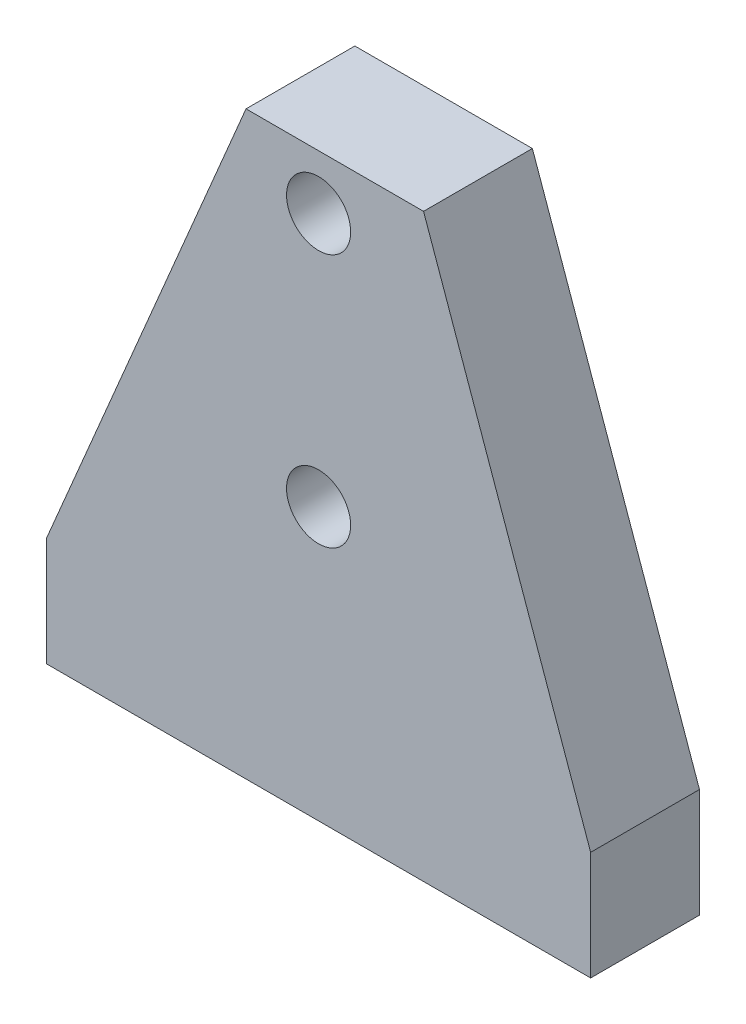
ISO-10303-21;
HEADER;
FILE_DESCRIPTION(('STEP AP214'),'2;1');
FILE_NAME('part.step','',(''),(''),'','','');
FILE_SCHEMA(('AUTOMOTIVE_DESIGN { 1 0 10303 214 1 1 1 1 }'));
ENDSEC;
DATA;
#1=APPLICATION_CONTEXT('core data for automotive mechanical design processes');
#2=APPLICATION_PROTOCOL_DEFINITION('international standard','automotive_design',2000,#1);
#3=PRODUCT_CONTEXT('',#1,'mechanical');
#4=PRODUCT('Part','Part','',(#3));
#5=PRODUCT_RELATED_PRODUCT_CATEGORY('part','',(#4));
#6=PRODUCT_DEFINITION_FORMATION('','',#4);
#7=PRODUCT_DEFINITION_CONTEXT('part definition',#1,'design');
#8=PRODUCT_DEFINITION('design','',#6,#7);
#9=PRODUCT_DEFINITION_SHAPE('','',#8);
#10=(LENGTH_UNIT() NAMED_UNIT(*) SI_UNIT(.MILLI.,.METRE.));
#11=(NAMED_UNIT(*) PLANE_ANGLE_UNIT() SI_UNIT($,.RADIAN.));
#12=(NAMED_UNIT(*) SI_UNIT($,.STERADIAN.) SOLID_ANGLE_UNIT());
#13=UNCERTAINTY_MEASURE_WITH_UNIT(LENGTH_MEASURE(1.E-05),#10,'distance_accuracy_value','');
#14=(GEOMETRIC_REPRESENTATION_CONTEXT(3) GLOBAL_UNCERTAINTY_ASSIGNED_CONTEXT((#13)) GLOBAL_UNIT_ASSIGNED_CONTEXT((#10,
#11,#12)) REPRESENTATION_CONTEXT('',''));
#15=CARTESIAN_POINT('',(0.,0.,0.));
#16=DIRECTION('',(0.,0.,1.));
#17=DIRECTION('',(1.,0.,0.));
#18=AXIS2_PLACEMENT_3D('',#15,#16,#17);
#19=CARTESIAN_POINT('',(-14.5006273525722,6.13488080301129,9.525));
#20=DIRECTION('',(-0.920967251068559,0.389639990836697,0.));
#21=DIRECTION('',(-0.389639990836697,-0.920967251068559,0.));
#22=AXIS2_PLACEMENT_3D('',#19,#20,#21);
#23=PLANE('',#22);
#24=DIRECTION('',(0.389639990836697,0.920967251068559,0.));
#25=VECTOR('',#24,1.);
#26=CARTESIAN_POINT('',(-14.5006273525722,6.13488080301129,0.));
#27=LINE('',#26,#25);
#28=CARTESIAN_POINT('',(-23.8125,-15.875,0.));
#29=VERTEX_POINT('',#28);
#30=CARTESIAN_POINT('',(-6.35000000000003,25.4,0.));
#31=VERTEX_POINT('',#30);
#32=EDGE_CURVE('E120',#29,#31,#27,.T.);
#33=ORIENTED_EDGE('',*,*,#32,.F.);
#34=DIRECTION('',(0.,0.,-1.));
#35=VECTOR('',#34,1.);
#36=CARTESIAN_POINT('',(-23.8125,-15.875,9.525));
#37=LINE('',#36,#35);
#38=CARTESIAN_POINT('',(-23.8125,-15.875,9.525));
#39=VERTEX_POINT('',#38);
#40=EDGE_CURVE('E11',#39,#29,#37,.T.);
#41=ORIENTED_EDGE('',*,*,#40,.F.);
#42=DIRECTION('',(0.389639990836697,0.920967251068559,0.));
#43=VECTOR('',#42,1.);
#44=CARTESIAN_POINT('',(-14.5006273525722,6.13488080301129,9.525));
#45=LINE('',#44,#43);
#46=CARTESIAN_POINT('',(-6.35000000000003,25.4,9.525));
#47=VERTEX_POINT('',#46);
#48=EDGE_CURVE('E134',#39,#47,#45,.T.);
#49=ORIENTED_EDGE('',*,*,#48,.T.);
#50=DIRECTION('',(0.,0.,-1.));
#51=VECTOR('',#50,1.);
#52=CARTESIAN_POINT('',(-6.35000000000003,25.4,9.525));
#53=LINE('',#52,#51);
#54=EDGE_CURVE('E53',#47,#31,#53,.T.);
#55=ORIENTED_EDGE('',*,*,#54,.T.);
#56=EDGE_LOOP('',(#33,#41,#49,#55));
#57=FACE_BOUND('',#56,.T.);
#58=ADVANCED_FACE('F37',(#57),#23,.T.);
#59=CARTESIAN_POINT('',(-23.8125,0.,9.525));
#60=DIRECTION('',(1.,0.,0.));
#61=DIRECTION('',(0.,1.,0.));
#62=AXIS2_PLACEMENT_3D('',#59,#60,#61);
#63=PLANE('',#62);
#64=DIRECTION('',(0.,-1.,0.));
#65=VECTOR('',#64,1.);
#66=CARTESIAN_POINT('',(-23.8125,0.,0.));
#67=LINE('',#66,#65);
#68=CARTESIAN_POINT('',(-23.8125,-25.4,0.));
#69=VERTEX_POINT('',#68);
#70=EDGE_CURVE('E122',#29,#69,#67,.T.);
#71=ORIENTED_EDGE('',*,*,#70,.T.);
#72=DIRECTION('',(0.,0.,-1.));
#73=VECTOR('',#72,1.);
#74=CARTESIAN_POINT('',(-23.8125,-25.4,9.525));
#75=LINE('',#74,#73);
#76=CARTESIAN_POINT('',(-23.8125,-25.4,9.525));
#77=VERTEX_POINT('',#76);
#78=EDGE_CURVE('E45',#77,#69,#75,.T.);
#79=ORIENTED_EDGE('',*,*,#78,.F.);
#80=DIRECTION('',(0.,-1.,0.));
#81=VECTOR('',#80,1.);
#82=CARTESIAN_POINT('',(-23.8125,0.,9.525));
#83=LINE('',#82,#81);
#84=EDGE_CURVE('E115',#39,#77,#83,.T.);
#85=ORIENTED_EDGE('',*,*,#84,.F.);
#86=ORIENTED_EDGE('',*,*,#40,.T.);
#87=EDGE_LOOP('',(#71,#79,#85,#86));
#88=FACE_BOUND('',#87,.T.);
#89=ADVANCED_FACE('F158',(#88),#63,.F.);
#90=CARTESIAN_POINT('',(0.,-25.4,9.525));
#91=DIRECTION('',(0.,1.,0.));
#92=DIRECTION('',(0.,0.,1.));
#93=AXIS2_PLACEMENT_3D('',#90,#91,#92);
#94=PLANE('',#93);
#95=CARTESIAN_POINT('',(-13.9954,-25.4,4.76250000000001));
#96=DIRECTION('',(0.,-1.,0.));
#97=DIRECTION('',(0.,0.,-1.));
#98=AXIS2_PLACEMENT_3D('',#95,#96,#97);
#99=CIRCLE('',#98,2.49999999999999);
#100=CARTESIAN_POINT('',(-13.9954,-25.4,2.26250000000002));
#101=VERTEX_POINT('',#100);
#102=EDGE_CURVE('E273',#101,#101,#99,.T.);
#103=ORIENTED_EDGE('',*,*,#102,.F.);
#104=EDGE_LOOP('',(#103));
#105=FACE_BOUND('',#104,.T.);
#106=CARTESIAN_POINT('',(13.9954,-25.4,4.76250000000001));
#107=DIRECTION('',(0.,-1.,0.));
#108=DIRECTION('',(0.,0.,-1.));
#109=AXIS2_PLACEMENT_3D('',#106,#107,#108);
#110=CIRCLE('',#109,2.49999999999999);
#111=CARTESIAN_POINT('',(13.9954,-25.4,2.26250000000001));
#112=VERTEX_POINT('',#111);
#113=EDGE_CURVE('E275',#112,#112,#110,.T.);
#114=ORIENTED_EDGE('',*,*,#113,.F.);
#115=EDGE_LOOP('',(#114));
#116=FACE_BOUND('',#115,.T.);
#117=DIRECTION('',(1.,0.,0.));
#118=VECTOR('',#117,1.);
#119=CARTESIAN_POINT('',(0.,-25.4,0.));
#120=LINE('',#119,#118);
#121=CARTESIAN_POINT('',(23.8125,-25.4,0.));
#122=VERTEX_POINT('',#121);
#123=EDGE_CURVE('E125',#69,#122,#120,.T.);
#124=ORIENTED_EDGE('',*,*,#123,.T.);
#125=DIRECTION('',(0.,0.,-1.));
#126=VECTOR('',#125,1.);
#127=CARTESIAN_POINT('',(23.8125,-25.4,9.525));
#128=LINE('',#127,#126);
#129=CARTESIAN_POINT('',(23.8125,-25.4,9.525));
#130=VERTEX_POINT('',#129);
#131=EDGE_CURVE('E101',#130,#122,#128,.T.);
#132=ORIENTED_EDGE('',*,*,#131,.F.);
#133=DIRECTION('',(1.,0.,0.));
#134=VECTOR('',#133,1.);
#135=CARTESIAN_POINT('',(0.,-25.4,9.525));
#136=LINE('',#135,#134);
#137=EDGE_CURVE('E112',#77,#130,#136,.T.);
#138=ORIENTED_EDGE('',*,*,#137,.F.);
#139=ORIENTED_EDGE('',*,*,#78,.T.);
#140=EDGE_LOOP('',(#124,#132,#138,#139));
#141=FACE_BOUND('',#140,.T.);
#142=ADVANCED_FACE('F141',(#105,#116,#141),#94,.F.);
#143=CARTESIAN_POINT('',(23.8125,0.,9.525));
#144=DIRECTION('',(1.,0.,0.));
#145=DIRECTION('',(0.,1.,0.));
#146=AXIS2_PLACEMENT_3D('',#143,#144,#145);
#147=PLANE('',#146);
#148=DIRECTION('',(0.,-1.,0.));
#149=VECTOR('',#148,1.);
#150=CARTESIAN_POINT('',(23.8125,0.,0.));
#151=LINE('',#150,#149);
#152=CARTESIAN_POINT('',(23.8125,-15.875,0.));
#153=VERTEX_POINT('',#152);
#154=EDGE_CURVE('E98',#153,#122,#151,.T.);
#155=ORIENTED_EDGE('',*,*,#154,.F.);
#156=DIRECTION('',(0.,0.,-1.));
#157=VECTOR('',#156,1.);
#158=CARTESIAN_POINT('',(23.8125,-15.875,9.525));
#159=LINE('',#158,#157);
#160=CARTESIAN_POINT('',(23.8125,-15.875,9.525));
#161=VERTEX_POINT('',#160);
#162=EDGE_CURVE('E92',#161,#153,#159,.T.);
#163=ORIENTED_EDGE('',*,*,#162,.F.);
#164=DIRECTION('',(0.,-1.,0.));
#165=VECTOR('',#164,1.);
#166=CARTESIAN_POINT('',(23.8125,0.,9.525));
#167=LINE('',#166,#165);
#168=EDGE_CURVE('E96',#161,#130,#167,.T.);
#169=ORIENTED_EDGE('',*,*,#168,.T.);
#170=ORIENTED_EDGE('',*,*,#131,.T.);
#171=EDGE_LOOP('',(#155,#163,#169,#170));
#172=FACE_BOUND('',#171,.T.);
#173=ADVANCED_FACE('F94',(#172),#147,.T.);
#174=CARTESIAN_POINT('',(16.1581752394906,5.72572901331465,9.525));
#175=DIRECTION('',(-0.942571369899435,-0.334004809315528,0.));
#176=DIRECTION('',(0.334004809315528,-0.942571369899435,0.));
#177=AXIS2_PLACEMENT_3D('',#174,#175,#176);
#178=PLANE('',#177);
#179=DIRECTION('',(-0.334004809315528,0.942571369899435,0.));
#180=VECTOR('',#179,1.);
#181=CARTESIAN_POINT('',(16.1581752394906,5.72572901331465,0.));
#182=LINE('',#181,#180);
#183=CARTESIAN_POINT('',(9.186500373076,25.4,0.));
#184=VERTEX_POINT('',#183);
#185=EDGE_CURVE('E129',#153,#184,#182,.T.);
#186=ORIENTED_EDGE('',*,*,#185,.T.);
#187=DIRECTION('',(0.,0.,-1.));
#188=VECTOR('',#187,1.);
#189=CARTESIAN_POINT('',(9.186500373076,25.4,9.525));
#190=LINE('',#189,#188);
#191=CARTESIAN_POINT('',(9.186500373076,25.4,9.525));
#192=VERTEX_POINT('',#191);
#193=EDGE_CURVE('E73',#192,#184,#190,.T.);
#194=ORIENTED_EDGE('',*,*,#193,.F.);
#195=DIRECTION('',(-0.334004809315528,0.942571369899435,0.));
#196=VECTOR('',#195,1.);
#197=CARTESIAN_POINT('',(16.1581752394906,5.72572901331465,9.525));
#198=LINE('',#197,#196);
#199=EDGE_CURVE('E103',#161,#192,#198,.T.);
#200=ORIENTED_EDGE('',*,*,#199,.F.);
#201=ORIENTED_EDGE('',*,*,#162,.T.);
#202=EDGE_LOOP('',(#186,#194,#200,#201));
#203=FACE_BOUND('',#202,.T.);
#204=ADVANCED_FACE('F104',(#203),#178,.F.);
#205=CARTESIAN_POINT('',(0.,25.4,9.525));
#206=DIRECTION('',(0.,1.,0.));
#207=DIRECTION('',(0.,0.,1.));
#208=AXIS2_PLACEMENT_3D('',#205,#206,#207);
#209=PLANE('',#208);
#210=DIRECTION('',(1.,0.,0.));
#211=VECTOR('',#210,1.);
#212=CARTESIAN_POINT('',(0.,25.4,0.));
#213=LINE('',#212,#211);
#214=EDGE_CURVE('E131',#31,#184,#213,.T.);
#215=ORIENTED_EDGE('',*,*,#214,.F.);
#216=ORIENTED_EDGE('',*,*,#54,.F.);
#217=DIRECTION('',(1.,0.,0.));
#218=VECTOR('',#217,1.);
#219=CARTESIAN_POINT('',(0.,25.4,9.525));
#220=LINE('',#219,#218);
#221=EDGE_CURVE('E107',#47,#192,#220,.T.);
#222=ORIENTED_EDGE('',*,*,#221,.T.);
#223=ORIENTED_EDGE('',*,*,#193,.T.);
#224=EDGE_LOOP('',(#215,#216,#222,#223));
#225=FACE_BOUND('',#224,.T.);
#226=ADVANCED_FACE('F146',(#225),#209,.T.);
#227=CARTESIAN_POINT('',(0.,0.,9.525));
#228=DIRECTION('',(0.,0.,1.));
#229=DIRECTION('',(1.,0.,0.));
#230=AXIS2_PLACEMENT_3D('',#227,#228,#229);
#231=PLANE('',#230);
#232=CARTESIAN_POINT('',(0.,20.6375,9.525));
#233=DIRECTION('',(0.,0.,1.));
#234=DIRECTION('',(1.,0.,0.));
#235=AXIS2_PLACEMENT_3D('',#232,#233,#234);
#236=CIRCLE('',#235,2.80669999999999);
#237=CARTESIAN_POINT('',(2.80669999999998,20.6375,9.525));
#238=VERTEX_POINT('',#237);
#239=EDGE_CURVE('E283',#238,#238,#236,.T.);
#240=ORIENTED_EDGE('',*,*,#239,.F.);
#241=EDGE_LOOP('',(#240));
#242=FACE_BOUND('',#241,.T.);
#243=CARTESIAN_POINT('',(0.,-1.58749999999999,9.525));
#244=DIRECTION('',(0.,0.,1.));
#245=DIRECTION('',(1.,0.,0.));
#246=AXIS2_PLACEMENT_3D('',#243,#244,#245);
#247=CIRCLE('',#246,2.80669999999999);
#248=CARTESIAN_POINT('',(2.80669999999998,-1.58749999999999,9.525));
#249=VERTEX_POINT('',#248);
#250=EDGE_CURVE('E289',#249,#249,#247,.T.);
#251=ORIENTED_EDGE('',*,*,#250,.F.);
#252=EDGE_LOOP('',(#251));
#253=FACE_BOUND('',#252,.T.);
#254=ORIENTED_EDGE('',*,*,#48,.F.);
#255=ORIENTED_EDGE('',*,*,#84,.T.);
#256=ORIENTED_EDGE('',*,*,#137,.T.);
#257=ORIENTED_EDGE('',*,*,#168,.F.);
#258=ORIENTED_EDGE('',*,*,#199,.T.);
#259=ORIENTED_EDGE('',*,*,#221,.F.);
#260=EDGE_LOOP('',(#254,#255,#256,#257,#258,#259));
#261=FACE_BOUND('',#260,.T.);
#262=ADVANCED_FACE('F110',(#242,#253,#261),#231,.T.);
#263=CARTESIAN_POINT('',(0.,0.,0.));
#264=DIRECTION('',(0.,0.,1.));
#265=DIRECTION('',(1.,0.,0.));
#266=AXIS2_PLACEMENT_3D('',#263,#264,#265);
#267=PLANE('',#266);
#268=CARTESIAN_POINT('',(0.,20.6375,0.));
#269=DIRECTION('',(0.,0.,1.));
#270=DIRECTION('',(1.,0.,0.));
#271=AXIS2_PLACEMENT_3D('',#268,#269,#270);
#272=CIRCLE('',#271,2.8067);
#273=CARTESIAN_POINT('',(2.80669999999999,20.6375,0.));
#274=VERTEX_POINT('',#273);
#275=EDGE_CURVE('E286',#274,#274,#272,.T.);
#276=ORIENTED_EDGE('',*,*,#275,.T.);
#277=EDGE_LOOP('',(#276));
#278=FACE_BOUND('',#277,.T.);
#279=CARTESIAN_POINT('',(0.,-1.58749999999999,0.));
#280=DIRECTION('',(0.,0.,1.));
#281=DIRECTION('',(1.,0.,0.));
#282=AXIS2_PLACEMENT_3D('',#279,#280,#281);
#283=CIRCLE('',#282,2.8067);
#284=CARTESIAN_POINT('',(2.80669999999999,-1.58749999999999,0.));
#285=VERTEX_POINT('',#284);
#286=EDGE_CURVE('E123',#285,#285,#283,.T.);
#287=ORIENTED_EDGE('',*,*,#286,.T.);
#288=EDGE_LOOP('',(#287));
#289=FACE_BOUND('',#288,.T.);
#290=ORIENTED_EDGE('',*,*,#32,.T.);
#291=ORIENTED_EDGE('',*,*,#214,.T.);
#292=ORIENTED_EDGE('',*,*,#185,.F.);
#293=ORIENTED_EDGE('',*,*,#154,.T.);
#294=ORIENTED_EDGE('',*,*,#123,.F.);
#295=ORIENTED_EDGE('',*,*,#70,.F.);
#296=EDGE_LOOP('',(#290,#291,#292,#293,#294,#295));
#297=FACE_BOUND('',#296,.T.);
#298=ADVANCED_FACE('F145',(#278,#289,#297),#267,.F.);
#299=CARTESIAN_POINT('',(0.,-1.58749999999999,9.525));
#300=DIRECTION('',(0.,0.,1.));
#301=DIRECTION('',(1.,0.,0.));
#302=AXIS2_PLACEMENT_3D('',#299,#300,#301);
#303=CYLINDRICAL_SURFACE('',#302,2.80669999999999);
#304=ORIENTED_EDGE('',*,*,#286,.F.);
#305=EDGE_LOOP('',(#304));
#306=FACE_BOUND('',#305,.T.);
#307=ORIENTED_EDGE('',*,*,#250,.T.);
#308=EDGE_LOOP('',(#307));
#309=FACE_BOUND('',#308,.T.);
#310=ADVANCED_FACE('F196',(#306,#309),#303,.F.);
#311=CARTESIAN_POINT('',(0.,20.6375,9.525));
#312=DIRECTION('',(0.,0.,1.));
#313=DIRECTION('',(1.,0.,0.));
#314=AXIS2_PLACEMENT_3D('',#311,#312,#313);
#315=CYLINDRICAL_SURFACE('',#314,2.80669999999999);
#316=ORIENTED_EDGE('',*,*,#275,.F.);
#317=EDGE_LOOP('',(#316));
#318=FACE_BOUND('',#317,.T.);
#319=ORIENTED_EDGE('',*,*,#239,.T.);
#320=EDGE_LOOP('',(#319));
#321=FACE_BOUND('',#320,.T.);
#322=ADVANCED_FACE('F205',(#318,#321),#315,.F.);
#323=CARTESIAN_POINT('',(13.9954,-12.3952,4.76250000000001));
#324=DIRECTION('',(0.,1.,0.));
#325=DIRECTION('',(0.,0.,1.));
#326=AXIS2_PLACEMENT_3D('',#323,#324,#325);
#327=PLANE('',#326);
#328=CARTESIAN_POINT('',(13.9954,-12.3952,4.76250000000001));
#329=DIRECTION('',(0.,-1.,0.));
#330=DIRECTION('',(0.,0.,-1.));
#331=AXIS2_PLACEMENT_3D('',#328,#329,#330);
#332=CIRCLE('',#331,2.49999999999999);
#333=CARTESIAN_POINT('',(13.9954,-12.3952,2.26250000000002));
#334=VERTEX_POINT('',#333);
#335=EDGE_CURVE('E280',#334,#334,#332,.T.);
#336=ORIENTED_EDGE('',*,*,#335,.T.);
#337=EDGE_LOOP('',(#336));
#338=FACE_BOUND('',#337,.T.);
#339=ADVANCED_FACE('F214',(#338),#327,.F.);
#340=CARTESIAN_POINT('',(13.9954,-25.4,4.76250000000001));
#341=DIRECTION('',(0.,-1.,0.));
#342=DIRECTION('',(0.,0.,-1.));
#343=AXIS2_PLACEMENT_3D('',#340,#341,#342);
#344=CYLINDRICAL_SURFACE('',#343,2.49999999999999);
#345=ORIENTED_EDGE('',*,*,#335,.F.);
#346=EDGE_LOOP('',(#345));
#347=FACE_BOUND('',#346,.T.);
#348=ORIENTED_EDGE('',*,*,#113,.T.);
#349=EDGE_LOOP('',(#348));
#350=FACE_BOUND('',#349,.T.);
#351=ADVANCED_FACE('F230',(#347,#350),#344,.F.);
#352=CARTESIAN_POINT('',(-13.9954,-12.3952,4.76250000000001));
#353=DIRECTION('',(0.,1.,0.));
#354=DIRECTION('',(0.,0.,1.));
#355=AXIS2_PLACEMENT_3D('',#352,#353,#354);
#356=PLANE('',#355);
#357=CARTESIAN_POINT('',(-13.9954,-12.3952,4.76250000000001));
#358=DIRECTION('',(0.,-1.,0.));
#359=DIRECTION('',(0.,0.,-1.));
#360=AXIS2_PLACEMENT_3D('',#357,#358,#359);
#361=CIRCLE('',#360,2.49999999999999);
#362=CARTESIAN_POINT('',(-13.9954,-12.3952,2.26250000000002));
#363=VERTEX_POINT('',#362);
#364=EDGE_CURVE('E270',#363,#363,#361,.T.);
#365=ORIENTED_EDGE('',*,*,#364,.T.);
#366=EDGE_LOOP('',(#365));
#367=FACE_BOUND('',#366,.T.);
#368=ADVANCED_FACE('F241',(#367),#356,.F.);
#369=CARTESIAN_POINT('',(-13.9954,-25.4,4.76250000000001));
#370=DIRECTION('',(0.,-1.,0.));
#371=DIRECTION('',(0.,0.,-1.));
#372=AXIS2_PLACEMENT_3D('',#369,#370,#371);
#373=CYLINDRICAL_SURFACE('',#372,2.49999999999999);
#374=ORIENTED_EDGE('',*,*,#364,.F.);
#375=EDGE_LOOP('',(#374));
#376=FACE_BOUND('',#375,.T.);
#377=ORIENTED_EDGE('',*,*,#102,.T.);
#378=EDGE_LOOP('',(#377));
#379=FACE_BOUND('',#378,.T.);
#380=ADVANCED_FACE('F252',(#376,#379),#373,.F.);
#381=CLOSED_SHELL('',(#58,#89,#142,#173,#204,#226,#262,#298,#310,#322,#339,#351,#368,#380));
#382=MANIFOLD_SOLID_BREP('B2',#381);
#383=ADVANCED_BREP_SHAPE_REPRESENTATION('',(#18,#382),#14);
#384=SHAPE_DEFINITION_REPRESENTATION(#9,#383);
ENDSEC;
END-ISO-10303-21;
